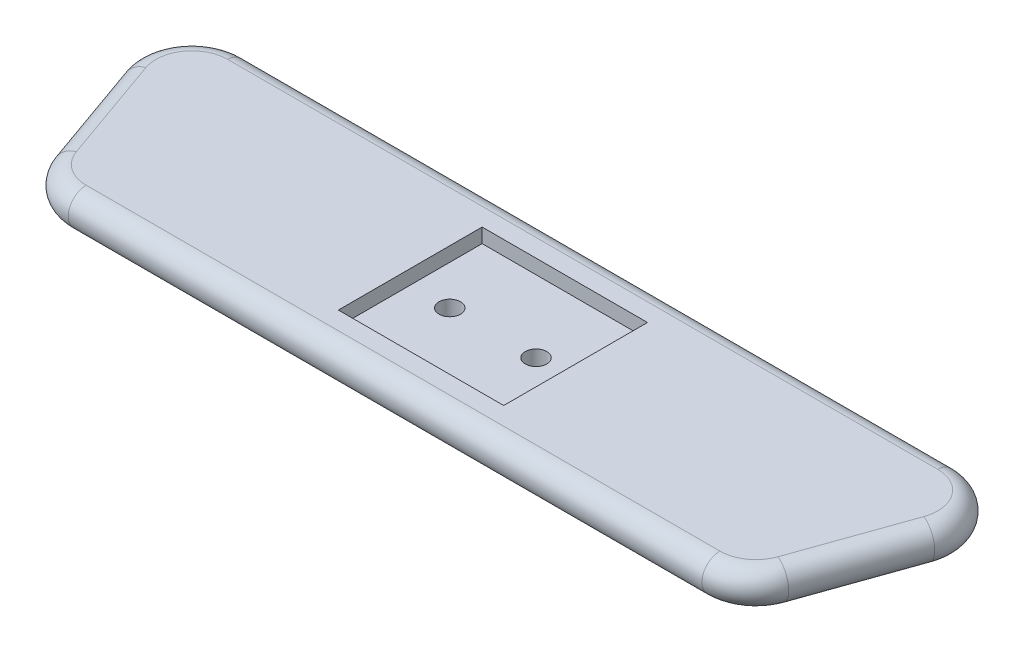
ISO-10303-21;
HEADER;
FILE_DESCRIPTION(('STEP AP214'),'2;1');
FILE_NAME('part.step','',(''),(''),'','','');
FILE_SCHEMA(('AUTOMOTIVE_DESIGN { 1 0 10303 214 1 1 1 1 }'));
ENDSEC;
DATA;
#1=APPLICATION_CONTEXT('core data for automotive mechanical design processes');
#2=APPLICATION_PROTOCOL_DEFINITION('international standard','automotive_design',2000,#1);
#3=PRODUCT_CONTEXT('',#1,'mechanical');
#4=PRODUCT('Part','Part','',(#3));
#5=PRODUCT_RELATED_PRODUCT_CATEGORY('part','',(#4));
#6=PRODUCT_DEFINITION_FORMATION('','',#4);
#7=PRODUCT_DEFINITION_CONTEXT('part definition',#1,'design');
#8=PRODUCT_DEFINITION('design','',#6,#7);
#9=PRODUCT_DEFINITION_SHAPE('','',#8);
#10=(LENGTH_UNIT() NAMED_UNIT(*) SI_UNIT(.MILLI.,.METRE.));
#11=(NAMED_UNIT(*) PLANE_ANGLE_UNIT() SI_UNIT($,.RADIAN.));
#12=(NAMED_UNIT(*) SI_UNIT($,.STERADIAN.) SOLID_ANGLE_UNIT());
#13=UNCERTAINTY_MEASURE_WITH_UNIT(LENGTH_MEASURE(1.E-05),#10,'distance_accuracy_value','');
#14=(GEOMETRIC_REPRESENTATION_CONTEXT(3) GLOBAL_UNCERTAINTY_ASSIGNED_CONTEXT((#13)) GLOBAL_UNIT_ASSIGNED_CONTEXT((#10,
#11,#12)) REPRESENTATION_CONTEXT('',''));
#15=CARTESIAN_POINT('',(0.,0.,0.));
#16=DIRECTION('',(0.,0.,1.));
#17=DIRECTION('',(1.,0.,0.));
#18=AXIS2_PLACEMENT_3D('',#15,#16,#17);
#19=CARTESIAN_POINT('',(-88.1519337423437,5.,19.9928971114934));
#20=DIRECTION('',(1.,0.,0.));
#21=DIRECTION('',(0.,0.,-1.));
#22=AXIS2_PLACEMENT_3D('',#19,#20,#21);
#23=CYLINDRICAL_SURFACE('',#22,5.);
#24=CARTESIAN_POINT('',(88.1519337423434,5.,19.9928971114934));
#25=DIRECTION('',(1.,0.,0.));
#26=DIRECTION('',(0.,0.,-1.));
#27=AXIS2_PLACEMENT_3D('',#24,#25,#26);
#28=CIRCLE('',#27,5.);
#29=CARTESIAN_POINT('',(88.1519337423434,10.,19.9928971114934));
#30=VERTEX_POINT('',#29);
#31=CARTESIAN_POINT('',(88.1519337423434,0.,19.9928971114934));
#32=VERTEX_POINT('',#31);
#33=EDGE_CURVE('E11',#30,#32,#28,.T.);
#34=ORIENTED_EDGE('',*,*,#33,.F.);
#35=DIRECTION('',(1.,0.,0.));
#36=VECTOR('',#35,1.);
#37=CARTESIAN_POINT('',(88.1519337423434,10.,19.9928971114934));
#38=LINE('',#37,#36);
#39=CARTESIAN_POINT('',(-88.1519337423437,10.,19.9928971114934));
#40=VERTEX_POINT('',#39);
#41=EDGE_CURVE('E186',#40,#30,#38,.T.);
#42=ORIENTED_EDGE('',*,*,#41,.F.);
#43=CARTESIAN_POINT('',(-88.1519337423437,5.,19.9928971114934));
#44=DIRECTION('',(1.,0.,0.));
#45=DIRECTION('',(0.,0.,-1.));
#46=AXIS2_PLACEMENT_3D('',#43,#44,#45);
#47=CIRCLE('',#46,5.);
#48=CARTESIAN_POINT('',(-88.1519337423437,0.,19.9928971114934));
#49=VERTEX_POINT('',#48);
#50=EDGE_CURVE('E56',#40,#49,#47,.T.);
#51=ORIENTED_EDGE('',*,*,#50,.T.);
#52=DIRECTION('',(-1.,0.,0.));
#53=VECTOR('',#52,1.);
#54=CARTESIAN_POINT('',(-88.1519337423437,0.,19.9928971114934));
#55=LINE('',#54,#53);
#56=EDGE_CURVE('E223',#32,#49,#55,.T.);
#57=ORIENTED_EDGE('',*,*,#56,.F.);
#58=EDGE_LOOP('',(#34,#42,#51,#57));
#59=FACE_BOUND('',#58,.T.);
#60=ADVANCED_FACE('F47',(#59),#23,.T.);
#61=CARTESIAN_POINT('',(-88.1519337423437,5.,9.99289711149338));
#62=DIRECTION('',(0.,1.,0.));
#63=DIRECTION('',(0.,0.,1.));
#64=AXIS2_PLACEMENT_3D('',#61,#62,#63);
#65=TOROIDAL_SURFACE('',#64,10.,5.);
#66=ORIENTED_EDGE('',*,*,#50,.F.);
#67=CARTESIAN_POINT('',(-88.1519337423437,10.,9.99289711149338));
#68=DIRECTION('',(0.,-1.,0.));
#69=DIRECTION('',(0.,0.,-1.));
#70=AXIS2_PLACEMENT_3D('',#67,#68,#69);
#71=CIRCLE('',#70,10.);
#72=CARTESIAN_POINT('',(-97.5783486532655,10.,13.3309657038311));
#73=VERTEX_POINT('',#72);
#74=EDGE_CURVE('E195',#73,#40,#71,.F.);
#75=ORIENTED_EDGE('',*,*,#74,.F.);
#76=CARTESIAN_POINT('',(-97.5783486532655,5.,13.3309657038311));
#77=DIRECTION('',(0.333806859233767,0.,0.94264149109218));
#78=DIRECTION('',(0.94264149109218,0.,-0.333806859233767));
#79=AXIS2_PLACEMENT_3D('',#76,#77,#78);
#80=CIRCLE('',#79,5.);
#81=CARTESIAN_POINT('',(-97.5783486532655,0.,13.3309657038311));
#82=VERTEX_POINT('',#81);
#83=EDGE_CURVE('E269',#73,#82,#80,.T.);
#84=ORIENTED_EDGE('',*,*,#83,.T.);
#85=CARTESIAN_POINT('',(-88.1519337423437,0.,9.99289711149338));
#86=DIRECTION('',(0.,-1.,0.));
#87=DIRECTION('',(0.,0.,-1.));
#88=AXIS2_PLACEMENT_3D('',#85,#86,#87);
#89=CIRCLE('',#88,10.);
#90=EDGE_CURVE('E227',#49,#82,#89,.T.);
#91=ORIENTED_EDGE('',*,*,#90,.F.);
#92=EDGE_LOOP('',(#66,#75,#84,#91));
#93=FACE_BOUND('',#92,.T.);
#94=ADVANCED_FACE('F278',(#93),#65,.T.);
#95=CARTESIAN_POINT('',(-108.201905829186,5.,-16.6690342961689));
#96=DIRECTION('',(0.333806859233768,0.,0.94264149109218));
#97=DIRECTION('',(0.94264149109218,0.,-0.333806859233768));
#98=AXIS2_PLACEMENT_3D('',#95,#96,#97);
#99=CYLINDRICAL_SURFACE('',#98,5.);
#100=ORIENTED_EDGE('',*,*,#83,.F.);
#101=DIRECTION('',(0.333806859233768,0.,0.94264149109218));
#102=VECTOR('',#101,1.);
#103=CARTESIAN_POINT('',(-77.9333342134071,10.,68.8067751183617));
#104=LINE('',#103,#102);
#105=CARTESIAN_POINT('',(-108.201905829186,10.,-16.6690342961689));
#106=VERTEX_POINT('',#105);
#107=EDGE_CURVE('E199',#106,#73,#104,.T.);
#108=ORIENTED_EDGE('',*,*,#107,.F.);
#109=CARTESIAN_POINT('',(-108.201905829186,5.,-16.6690342961689));
#110=DIRECTION('',(0.333806859233768,0.,0.942641491092179));
#111=DIRECTION('',(0.942641491092179,0.,-0.333806859233768));
#112=AXIS2_PLACEMENT_3D('',#109,#110,#111);
#113=CIRCLE('',#112,5.);
#114=CARTESIAN_POINT('',(-108.201905829186,0.,-16.6690342961689));
#115=VERTEX_POINT('',#114);
#116=EDGE_CURVE('E266',#106,#115,#113,.T.);
#117=ORIENTED_EDGE('',*,*,#116,.T.);
#118=DIRECTION('',(-0.333806859233768,0.,-0.94264149109218));
#119=VECTOR('',#118,1.);
#120=CARTESIAN_POINT('',(-108.201905829186,0.,-16.6690342961689));
#121=LINE('',#120,#119);
#122=EDGE_CURVE('E231',#82,#115,#121,.T.);
#123=ORIENTED_EDGE('',*,*,#122,.F.);
#124=EDGE_LOOP('',(#100,#108,#117,#123));
#125=FACE_BOUND('',#124,.T.);
#126=ADVANCED_FACE('F290',(#125),#99,.T.);
#127=CARTESIAN_POINT('',(-98.7754909182645,5.,-20.0071028885066));
#128=DIRECTION('',(0.,1.,0.));
#129=DIRECTION('',(0.,0.,1.));
#130=AXIS2_PLACEMENT_3D('',#127,#128,#129);
#131=TOROIDAL_SURFACE('',#130,10.,5.);
#132=ORIENTED_EDGE('',*,*,#116,.F.);
#133=CARTESIAN_POINT('',(-98.7754909182645,10.,-20.0071028885066));
#134=DIRECTION('',(0.,-1.,0.));
#135=DIRECTION('',(0.,0.,-1.));
#136=AXIS2_PLACEMENT_3D('',#133,#134,#135);
#137=CIRCLE('',#136,10.);
#138=CARTESIAN_POINT('',(-98.7754909182645,10.,-30.0071028885066));
#139=VERTEX_POINT('',#138);
#140=EDGE_CURVE('E203',#139,#106,#137,.F.);
#141=ORIENTED_EDGE('',*,*,#140,.F.);
#142=CARTESIAN_POINT('',(-98.7754909182645,5.,-30.0071028885066));
#143=DIRECTION('',(-1.,0.,0.));
#144=DIRECTION('',(0.,-1.,0.));
#145=AXIS2_PLACEMENT_3D('',#142,#143,#144);
#146=CIRCLE('',#145,5.);
#147=CARTESIAN_POINT('',(-98.7754909182645,0.,-30.0071028885066));
#148=VERTEX_POINT('',#147);
#149=EDGE_CURVE('E263',#139,#148,#146,.T.);
#150=ORIENTED_EDGE('',*,*,#149,.T.);
#151=CARTESIAN_POINT('',(-98.7754909182645,0.,-20.0071028885066));
#152=DIRECTION('',(0.,-1.,0.));
#153=DIRECTION('',(0.,0.,-1.));
#154=AXIS2_PLACEMENT_3D('',#151,#152,#153);
#155=CIRCLE('',#154,10.);
#156=EDGE_CURVE('E235',#115,#148,#155,.T.);
#157=ORIENTED_EDGE('',*,*,#156,.F.);
#158=EDGE_LOOP('',(#132,#141,#150,#157));
#159=FACE_BOUND('',#158,.T.);
#160=ADVANCED_FACE('F294',(#159),#131,.T.);
#161=CARTESIAN_POINT('',(98.7754909182645,5.,-30.0071028885066));
#162=DIRECTION('',(-1.,0.,0.));
#163=DIRECTION('',(0.,0.,1.));
#164=AXIS2_PLACEMENT_3D('',#161,#162,#163);
#165=CYLINDRICAL_SURFACE('',#164,5.);
#166=ORIENTED_EDGE('',*,*,#149,.F.);
#167=DIRECTION('',(-1.,0.,0.));
#168=VECTOR('',#167,1.);
#169=CARTESIAN_POINT('',(88.1519337423434,10.,-30.0071028885067));
#170=LINE('',#169,#168);
#171=CARTESIAN_POINT('',(98.7754909182645,10.,-30.0071028885067));
#172=VERTEX_POINT('',#171);
#173=EDGE_CURVE('E207',#172,#139,#170,.T.);
#174=ORIENTED_EDGE('',*,*,#173,.F.);
#175=CARTESIAN_POINT('',(98.7754909182645,5.,-30.0071028885066));
#176=DIRECTION('',(-1.,0.,0.));
#177=DIRECTION('',(0.,0.,1.));
#178=AXIS2_PLACEMENT_3D('',#175,#176,#177);
#179=CIRCLE('',#178,5.);
#180=CARTESIAN_POINT('',(98.7754909182645,0.,-30.0071028885067));
#181=VERTEX_POINT('',#180);
#182=EDGE_CURVE('E260',#172,#181,#179,.T.);
#183=ORIENTED_EDGE('',*,*,#182,.T.);
#184=DIRECTION('',(1.,0.,0.));
#185=VECTOR('',#184,1.);
#186=CARTESIAN_POINT('',(98.7754909182645,0.,-30.0071028885066));
#187=LINE('',#186,#185);
#188=EDGE_CURVE('E239',#148,#181,#187,.T.);
#189=ORIENTED_EDGE('',*,*,#188,.F.);
#190=EDGE_LOOP('',(#166,#174,#183,#189));
#191=FACE_BOUND('',#190,.T.);
#192=ADVANCED_FACE('F297',(#191),#165,.T.);
#193=CARTESIAN_POINT('',(98.7754909182645,5.,-20.0071028885066));
#194=DIRECTION('',(0.,1.,0.));
#195=DIRECTION('',(0.,0.,1.));
#196=AXIS2_PLACEMENT_3D('',#193,#194,#195);
#197=TOROIDAL_SURFACE('',#196,10.,5.);
#198=ORIENTED_EDGE('',*,*,#182,.F.);
#199=CARTESIAN_POINT('',(98.7754909182645,10.,-20.0071028885066));
#200=DIRECTION('',(0.,-1.,0.));
#201=DIRECTION('',(0.,0.,-1.));
#202=AXIS2_PLACEMENT_3D('',#199,#200,#201);
#203=CIRCLE('',#202,10.);
#204=CARTESIAN_POINT('',(108.201905829186,10.,-16.6690342961689));
#205=VERTEX_POINT('',#204);
#206=EDGE_CURVE('E211',#205,#172,#203,.F.);
#207=ORIENTED_EDGE('',*,*,#206,.F.);
#208=CARTESIAN_POINT('',(108.201905829186,5.,-16.6690342961689));
#209=DIRECTION('',(0.333806859233774,0.,-0.942641491092177));
#210=DIRECTION('',(-0.942641491092177,0.,-0.333806859233774));
#211=AXIS2_PLACEMENT_3D('',#208,#209,#210);
#212=CIRCLE('',#211,5.);
#213=CARTESIAN_POINT('',(108.201905829186,0.,-16.6690342961689));
#214=VERTEX_POINT('',#213);
#215=EDGE_CURVE('E257',#205,#214,#212,.T.);
#216=ORIENTED_EDGE('',*,*,#215,.T.);
#217=CARTESIAN_POINT('',(98.7754909182645,0.,-20.0071028885066));
#218=DIRECTION('',(0.,-1.,0.));
#219=DIRECTION('',(0.,0.,-1.));
#220=AXIS2_PLACEMENT_3D('',#217,#218,#219);
#221=CIRCLE('',#220,10.);
#222=EDGE_CURVE('E243',#181,#214,#221,.T.);
#223=ORIENTED_EDGE('',*,*,#222,.F.);
#224=EDGE_LOOP('',(#198,#207,#216,#223));
#225=FACE_BOUND('',#224,.T.);
#226=ADVANCED_FACE('F301',(#225),#197,.T.);
#227=CARTESIAN_POINT('',(97.5783486532652,5.,13.3309657038312));
#228=DIRECTION('',(0.333806859233775,0.,-0.942641491092177));
#229=DIRECTION('',(-0.942641491092177,0.,-0.333806859233775));
#230=AXIS2_PLACEMENT_3D('',#227,#228,#229);
#231=CYLINDRICAL_SURFACE('',#230,5.);
#232=ORIENTED_EDGE('',*,*,#215,.F.);
#233=DIRECTION('',(0.333806859233775,0.,-0.942641491092177));
#234=VECTOR('',#233,1.);
#235=CARTESIAN_POINT('',(97.5783486532652,10.,13.3309657038312));
#236=LINE('',#235,#234);
#237=CARTESIAN_POINT('',(97.5783486532652,10.,13.3309657038312));
#238=VERTEX_POINT('',#237);
#239=EDGE_CURVE('E215',#238,#205,#236,.T.);
#240=ORIENTED_EDGE('',*,*,#239,.F.);
#241=CARTESIAN_POINT('',(97.5783486532652,5.,13.3309657038312));
#242=DIRECTION('',(0.333806859233775,0.,-0.942641491092177));
#243=DIRECTION('',(-0.942641491092177,0.,-0.333806859233775));
#244=AXIS2_PLACEMENT_3D('',#241,#242,#243);
#245=CIRCLE('',#244,5.);
#246=CARTESIAN_POINT('',(97.5783486532652,0.,13.3309657038312));
#247=VERTEX_POINT('',#246);
#248=EDGE_CURVE('E71',#238,#247,#245,.T.);
#249=ORIENTED_EDGE('',*,*,#248,.T.);
#250=DIRECTION('',(-0.333806859233775,0.,0.942641491092177));
#251=VECTOR('',#250,1.);
#252=CARTESIAN_POINT('',(97.5783486532652,0.,13.3309657038312));
#253=LINE('',#252,#251);
#254=EDGE_CURVE('E247',#214,#247,#253,.T.);
#255=ORIENTED_EDGE('',*,*,#254,.F.);
#256=EDGE_LOOP('',(#232,#240,#249,#255));
#257=FACE_BOUND('',#256,.T.);
#258=ADVANCED_FACE('F302',(#257),#231,.T.);
#259=CARTESIAN_POINT('',(88.1519337423434,5.,9.99289711149341));
#260=DIRECTION('',(0.,1.,0.));
#261=DIRECTION('',(0.,0.,1.));
#262=AXIS2_PLACEMENT_3D('',#259,#260,#261);
#263=TOROIDAL_SURFACE('',#262,10.,5.);
#264=CARTESIAN_POINT('',(88.1519337423434,10.,9.99289711149341));
#265=DIRECTION('',(0.,-1.,0.));
#266=DIRECTION('',(0.,0.,-1.));
#267=AXIS2_PLACEMENT_3D('',#264,#265,#266);
#268=CIRCLE('',#267,10.);
#269=EDGE_CURVE('E219',#30,#238,#268,.F.);
#270=ORIENTED_EDGE('',*,*,#269,.F.);
#271=ORIENTED_EDGE('',*,*,#33,.T.);
#272=CARTESIAN_POINT('',(88.1519337423434,0.,9.99289711149341));
#273=DIRECTION('',(0.,-1.,0.));
#274=DIRECTION('',(0.,0.,-1.));
#275=AXIS2_PLACEMENT_3D('',#272,#273,#274);
#276=CIRCLE('',#275,10.);
#277=EDGE_CURVE('E251',#247,#32,#276,.T.);
#278=ORIENTED_EDGE('',*,*,#277,.F.);
#279=ORIENTED_EDGE('',*,*,#248,.F.);
#280=EDGE_LOOP('',(#270,#271,#278,#279));
#281=FACE_BOUND('',#280,.T.);
#282=ADVANCED_FACE('F284',(#281),#263,.T.);
#283=CARTESIAN_POINT('',(88.1519337423434,10.,9.99289711149341));
#284=DIRECTION('',(0.,-1.,0.));
#285=DIRECTION('',(0.,0.,-1.));
#286=AXIS2_PLACEMENT_3D('',#283,#284,#285);
#287=PLANE('',#286);
#288=DIRECTION('',(-1.,0.,0.));
#289=VECTOR('',#288,1.);
#290=CARTESIAN_POINT('',(-23.,10.,-25.0071028885066));
#291=LINE('',#290,#289);
#292=CARTESIAN_POINT('',(23.,10.,-25.0071028885066));
#293=VERTEX_POINT('',#292);
#294=CARTESIAN_POINT('',(-23.,10.,-25.0071028885066));
#295=VERTEX_POINT('',#294);
#296=EDGE_CURVE('E176',#293,#295,#291,.T.);
#297=ORIENTED_EDGE('',*,*,#296,.F.);
#298=DIRECTION('',(0.,0.,-1.));
#299=VECTOR('',#298,1.);
#300=CARTESIAN_POINT('',(23.,10.,-25.0071028885066));
#301=LINE('',#300,#299);
#302=CARTESIAN_POINT('',(23.,10.,14.9928971114934));
#303=VERTEX_POINT('',#302);
#304=EDGE_CURVE('E63',#303,#293,#301,.T.);
#305=ORIENTED_EDGE('',*,*,#304,.F.);
#306=DIRECTION('',(1.,0.,0.));
#307=VECTOR('',#306,1.);
#308=CARTESIAN_POINT('',(-23.,10.,14.9928971114934));
#309=LINE('',#308,#307);
#310=CARTESIAN_POINT('',(-23.,10.,14.9928971114934));
#311=VERTEX_POINT('',#310);
#312=EDGE_CURVE('E160',#311,#303,#309,.T.);
#313=ORIENTED_EDGE('',*,*,#312,.F.);
#314=DIRECTION('',(0.,0.,1.));
#315=VECTOR('',#314,1.);
#316=CARTESIAN_POINT('',(-23.,10.,-25.0071028885066));
#317=LINE('',#316,#315);
#318=EDGE_CURVE('E164',#295,#311,#317,.T.);
#319=ORIENTED_EDGE('',*,*,#318,.F.);
#320=EDGE_LOOP('',(#297,#305,#313,#319));
#321=FACE_BOUND('',#320,.T.);
#322=ORIENTED_EDGE('',*,*,#41,.T.);
#323=ORIENTED_EDGE('',*,*,#269,.T.);
#324=ORIENTED_EDGE('',*,*,#239,.T.);
#325=ORIENTED_EDGE('',*,*,#206,.T.);
#326=ORIENTED_EDGE('',*,*,#173,.T.);
#327=ORIENTED_EDGE('',*,*,#140,.T.);
#328=ORIENTED_EDGE('',*,*,#107,.T.);
#329=ORIENTED_EDGE('',*,*,#74,.T.);
#330=EDGE_LOOP('',(#322,#323,#324,#325,#326,#327,#328,#329));
#331=FACE_BOUND('',#330,.T.);
#332=ADVANCED_FACE('F286',(#321,#331),#287,.F.);
#333=CARTESIAN_POINT('',(88.1519337423434,0.,9.99289711149341));
#334=DIRECTION('',(0.,-1.,0.));
#335=DIRECTION('',(0.,0.,-1.));
#336=AXIS2_PLACEMENT_3D('',#333,#334,#335);
#337=PLANE('',#336);
#338=CARTESIAN_POINT('',(69.9999999999999,0.,2.99289711149415));
#339=DIRECTION('',(0.,-1.,0.));
#340=DIRECTION('',(0.,0.,1.));
#341=AXIS2_PLACEMENT_3D('',#338,#339,#340);
#342=CIRCLE('',#341,1.99999999999999);
#343=CARTESIAN_POINT('',(69.9999999999999,0.,4.99289711149414));
#344=VERTEX_POINT('',#343);
#345=EDGE_CURVE('E433',#344,#344,#342,.T.);
#346=ORIENTED_EDGE('',*,*,#345,.F.);
#347=EDGE_LOOP('',(#346));
#348=FACE_BOUND('',#347,.T.);
#349=CARTESIAN_POINT('',(70.,0.,-13.0071028885059));
#350=DIRECTION('',(0.,-1.,0.));
#351=DIRECTION('',(0.,0.,-1.));
#352=AXIS2_PLACEMENT_3D('',#349,#350,#351);
#353=CIRCLE('',#352,2.);
#354=CARTESIAN_POINT('',(70.,0.,-15.0071028885059));
#355=VERTEX_POINT('',#354);
#356=EDGE_CURVE('E423',#355,#355,#353,.T.);
#357=ORIENTED_EDGE('',*,*,#356,.F.);
#358=EDGE_LOOP('',(#357));
#359=FACE_BOUND('',#358,.T.);
#360=CARTESIAN_POINT('',(-70.,0.,-13.0071028885066));
#361=DIRECTION('',(0.,-1.,0.));
#362=DIRECTION('',(0.,0.,1.));
#363=AXIS2_PLACEMENT_3D('',#360,#361,#362);
#364=CIRCLE('',#363,2.);
#365=CARTESIAN_POINT('',(-70.,0.,-11.0071028885066));
#366=VERTEX_POINT('',#365);
#367=EDGE_CURVE('E413',#366,#366,#364,.T.);
#368=ORIENTED_EDGE('',*,*,#367,.F.);
#369=EDGE_LOOP('',(#368));
#370=FACE_BOUND('',#369,.T.);
#371=CARTESIAN_POINT('',(-70.,0.,2.99289711149337));
#372=DIRECTION('',(0.,-1.,0.));
#373=DIRECTION('',(0.,0.,-1.));
#374=AXIS2_PLACEMENT_3D('',#371,#372,#373);
#375=CIRCLE('',#374,2.);
#376=CARTESIAN_POINT('',(-70.,0.,0.992897111493374));
#377=VERTEX_POINT('',#376);
#378=EDGE_CURVE('E416',#377,#377,#375,.T.);
#379=ORIENTED_EDGE('',*,*,#378,.F.);
#380=EDGE_LOOP('',(#379));
#381=FACE_BOUND('',#380,.T.);
#382=CARTESIAN_POINT('',(-12.,0.,-5.00710288850664));
#383=DIRECTION('',(0.,-1.,0.));
#384=DIRECTION('',(0.,0.,-1.));
#385=AXIS2_PLACEMENT_3D('',#382,#383,#384);
#386=CIRCLE('',#385,3.);
#387=CARTESIAN_POINT('',(-12.,0.,-8.00710288850664));
#388=VERTEX_POINT('',#387);
#389=EDGE_CURVE('E447',#388,#388,#386,.F.);
#390=ORIENTED_EDGE('',*,*,#389,.T.);
#391=EDGE_LOOP('',(#390));
#392=FACE_BOUND('',#391,.T.);
#393=CARTESIAN_POINT('',(12.,0.,-5.00710288850663));
#394=DIRECTION('',(0.,-1.,0.));
#395=DIRECTION('',(0.,0.,-1.));
#396=AXIS2_PLACEMENT_3D('',#393,#394,#395);
#397=CIRCLE('',#396,3.);
#398=CARTESIAN_POINT('',(12.,0.,-8.00710288850663));
#399=VERTEX_POINT('',#398);
#400=EDGE_CURVE('E167',#399,#399,#397,.F.);
#401=ORIENTED_EDGE('',*,*,#400,.T.);
#402=EDGE_LOOP('',(#401));
#403=FACE_BOUND('',#402,.T.);
#404=ORIENTED_EDGE('',*,*,#254,.T.);
#405=ORIENTED_EDGE('',*,*,#277,.T.);
#406=ORIENTED_EDGE('',*,*,#56,.T.);
#407=ORIENTED_EDGE('',*,*,#90,.T.);
#408=ORIENTED_EDGE('',*,*,#122,.T.);
#409=ORIENTED_EDGE('',*,*,#156,.T.);
#410=ORIENTED_EDGE('',*,*,#188,.T.);
#411=ORIENTED_EDGE('',*,*,#222,.T.);
#412=EDGE_LOOP('',(#404,#405,#406,#407,#408,#409,#410,#411));
#413=FACE_BOUND('',#412,.T.);
#414=ADVANCED_FACE('F281',(#348,#359,#370,#381,#392,#403,#413),#337,.T.);
#415=CARTESIAN_POINT('',(23.,6.,-25.0071028885066));
#416=DIRECTION('',(1.,0.,0.));
#417=DIRECTION('',(0.,0.,-1.));
#418=AXIS2_PLACEMENT_3D('',#415,#416,#417);
#419=PLANE('',#418);
#420=ORIENTED_EDGE('',*,*,#304,.T.);
#421=DIRECTION('',(0.,1.,0.));
#422=VECTOR('',#421,1.);
#423=CARTESIAN_POINT('',(23.,6.,-25.0071028885066));
#424=LINE('',#423,#422);
#425=CARTESIAN_POINT('',(23.,6.,-25.0071028885066));
#426=VERTEX_POINT('',#425);
#427=EDGE_CURVE('E135',#426,#293,#424,.T.);
#428=ORIENTED_EDGE('',*,*,#427,.F.);
#429=DIRECTION('',(0.,0.,-1.));
#430=VECTOR('',#429,1.);
#431=CARTESIAN_POINT('',(23.,6.,-25.0071028885066));
#432=LINE('',#431,#430);
#433=CARTESIAN_POINT('',(23.,6.,14.9928971114934));
#434=VERTEX_POINT('',#433);
#435=EDGE_CURVE('E139',#434,#426,#432,.T.);
#436=ORIENTED_EDGE('',*,*,#435,.F.);
#437=DIRECTION('',(0.,1.,0.));
#438=VECTOR('',#437,1.);
#439=CARTESIAN_POINT('',(23.,6.,14.9928971114934));
#440=LINE('',#439,#438);
#441=EDGE_CURVE('E183',#434,#303,#440,.T.);
#442=ORIENTED_EDGE('',*,*,#441,.T.);
#443=EDGE_LOOP('',(#420,#428,#436,#442));
#444=FACE_BOUND('',#443,.T.);
#445=ADVANCED_FACE('F137',(#444),#419,.F.);
#446=CARTESIAN_POINT('',(-23.,6.,14.9928971114934));
#447=DIRECTION('',(0.,0.,1.));
#448=DIRECTION('',(1.,0.,0.));
#449=AXIS2_PLACEMENT_3D('',#446,#447,#448);
#450=PLANE('',#449);
#451=ORIENTED_EDGE('',*,*,#312,.T.);
#452=ORIENTED_EDGE('',*,*,#441,.F.);
#453=DIRECTION('',(1.,0.,0.));
#454=VECTOR('',#453,1.);
#455=CARTESIAN_POINT('',(-23.,6.,14.9928971114934));
#456=LINE('',#455,#454);
#457=CARTESIAN_POINT('',(-23.,6.,14.9928971114934));
#458=VERTEX_POINT('',#457);
#459=EDGE_CURVE('E146',#458,#434,#456,.T.);
#460=ORIENTED_EDGE('',*,*,#459,.F.);
#461=DIRECTION('',(0.,1.,0.));
#462=VECTOR('',#461,1.);
#463=CARTESIAN_POINT('',(-23.,6.,14.9928971114934));
#464=LINE('',#463,#462);
#465=EDGE_CURVE('E187',#458,#311,#464,.T.);
#466=ORIENTED_EDGE('',*,*,#465,.T.);
#467=EDGE_LOOP('',(#451,#452,#460,#466));
#468=FACE_BOUND('',#467,.T.);
#469=ADVANCED_FACE('F353',(#468),#450,.F.);
#470=CARTESIAN_POINT('',(-23.,6.,-25.0071028885066));
#471=DIRECTION('',(-1.,0.,0.));
#472=DIRECTION('',(0.,0.,1.));
#473=AXIS2_PLACEMENT_3D('',#470,#471,#472);
#474=PLANE('',#473);
#475=ORIENTED_EDGE('',*,*,#318,.T.);
#476=ORIENTED_EDGE('',*,*,#465,.F.);
#477=DIRECTION('',(0.,0.,1.));
#478=VECTOR('',#477,1.);
#479=CARTESIAN_POINT('',(-23.,6.,-25.0071028885066));
#480=LINE('',#479,#478);
#481=CARTESIAN_POINT('',(-23.,6.,-25.0071028885066));
#482=VERTEX_POINT('',#481);
#483=EDGE_CURVE('E155',#482,#458,#480,.T.);
#484=ORIENTED_EDGE('',*,*,#483,.F.);
#485=DIRECTION('',(0.,1.,0.));
#486=VECTOR('',#485,1.);
#487=CARTESIAN_POINT('',(-23.,6.,-25.0071028885066));
#488=LINE('',#487,#486);
#489=EDGE_CURVE('E145',#482,#295,#488,.T.);
#490=ORIENTED_EDGE('',*,*,#489,.T.);
#491=EDGE_LOOP('',(#475,#476,#484,#490));
#492=FACE_BOUND('',#491,.T.);
#493=ADVANCED_FACE('F356',(#492),#474,.F.);
#494=CARTESIAN_POINT('',(-23.,6.,-25.0071028885066));
#495=DIRECTION('',(0.,0.,-1.));
#496=DIRECTION('',(-1.,0.,0.));
#497=AXIS2_PLACEMENT_3D('',#494,#495,#496);
#498=PLANE('',#497);
#499=ORIENTED_EDGE('',*,*,#296,.T.);
#500=ORIENTED_EDGE('',*,*,#489,.F.);
#501=DIRECTION('',(-1.,0.,0.));
#502=VECTOR('',#501,1.);
#503=CARTESIAN_POINT('',(-23.,6.,-25.0071028885066));
#504=LINE('',#503,#502);
#505=EDGE_CURVE('E149',#426,#482,#504,.T.);
#506=ORIENTED_EDGE('',*,*,#505,.F.);
#507=ORIENTED_EDGE('',*,*,#427,.T.);
#508=EDGE_LOOP('',(#499,#500,#506,#507));
#509=FACE_BOUND('',#508,.T.);
#510=ADVANCED_FACE('F150',(#509),#498,.F.);
#511=CARTESIAN_POINT('',(0.,6.,0.));
#512=DIRECTION('',(0.,1.,0.));
#513=DIRECTION('',(0.,0.,1.));
#514=AXIS2_PLACEMENT_3D('',#511,#512,#513);
#515=PLANE('',#514);
#516=CARTESIAN_POINT('',(12.,6.,-5.00710288850663));
#517=DIRECTION('',(0.,1.,0.));
#518=DIRECTION('',(0.,0.,1.));
#519=AXIS2_PLACEMENT_3D('',#516,#517,#518);
#520=CIRCLE('',#519,3.);
#521=CARTESIAN_POINT('',(12.,6.,-2.00710288850663));
#522=VERTEX_POINT('',#521);
#523=EDGE_CURVE('E450',#522,#522,#520,.F.);
#524=ORIENTED_EDGE('',*,*,#523,.T.);
#525=EDGE_LOOP('',(#524));
#526=FACE_BOUND('',#525,.T.);
#527=CARTESIAN_POINT('',(-12.,6.,-5.00710288850664));
#528=DIRECTION('',(0.,1.,0.));
#529=DIRECTION('',(0.,0.,1.));
#530=AXIS2_PLACEMENT_3D('',#527,#528,#529);
#531=CIRCLE('',#530,3.);
#532=CARTESIAN_POINT('',(-12.,6.,-2.00710288850664));
#533=VERTEX_POINT('',#532);
#534=EDGE_CURVE('E177',#533,#533,#531,.F.);
#535=ORIENTED_EDGE('',*,*,#534,.T.);
#536=EDGE_LOOP('',(#535));
#537=FACE_BOUND('',#536,.T.);
#538=ORIENTED_EDGE('',*,*,#435,.T.);
#539=ORIENTED_EDGE('',*,*,#505,.T.);
#540=ORIENTED_EDGE('',*,*,#483,.T.);
#541=ORIENTED_EDGE('',*,*,#459,.T.);
#542=EDGE_LOOP('',(#538,#539,#540,#541));
#543=FACE_BOUND('',#542,.T.);
#544=ADVANCED_FACE('F157',(#526,#537,#543),#515,.T.);
#545=CARTESIAN_POINT('',(12.,-0.001000000000001,-5.00710288850663));
#546=DIRECTION('',(0.,1.,0.));
#547=DIRECTION('',(0.,0.,1.));
#548=AXIS2_PLACEMENT_3D('',#545,#546,#547);
#549=CYLINDRICAL_SURFACE('',#548,3.);
#550=ORIENTED_EDGE('',*,*,#400,.F.);
#551=EDGE_LOOP('',(#550));
#552=FACE_BOUND('',#551,.T.);
#553=ORIENTED_EDGE('',*,*,#523,.F.);
#554=EDGE_LOOP('',(#553));
#555=FACE_BOUND('',#554,.T.);
#556=ADVANCED_FACE('F365',(#552,#555),#549,.F.);
#557=CARTESIAN_POINT('',(-12.,-0.001000000000001,-5.00710288850664));
#558=DIRECTION('',(0.,1.,0.));
#559=DIRECTION('',(0.,0.,1.));
#560=AXIS2_PLACEMENT_3D('',#557,#558,#559);
#561=CYLINDRICAL_SURFACE('',#560,3.);
#562=ORIENTED_EDGE('',*,*,#389,.F.);
#563=EDGE_LOOP('',(#562));
#564=FACE_BOUND('',#563,.T.);
#565=ORIENTED_EDGE('',*,*,#534,.F.);
#566=EDGE_LOOP('',(#565));
#567=FACE_BOUND('',#566,.T.);
#568=ADVANCED_FACE('F369',(#564,#567),#561,.F.);
#569=CARTESIAN_POINT('',(-70.,8.,2.99289711149337));
#570=DIRECTION('',(0.,-1.,0.));
#571=DIRECTION('',(0.,0.,-1.));
#572=AXIS2_PLACEMENT_3D('',#569,#570,#571);
#573=CYLINDRICAL_SURFACE('',#572,2.);
#574=CARTESIAN_POINT('',(-70.,8.,2.99289711149337));
#575=DIRECTION('',(0.,-1.,0.));
#576=DIRECTION('',(0.,0.,-1.));
#577=AXIS2_PLACEMENT_3D('',#574,#575,#576);
#578=CIRCLE('',#577,2.);
#579=CARTESIAN_POINT('',(-70.,8.,0.992897111493374));
#580=VERTEX_POINT('',#579);
#581=EDGE_CURVE('E421',#580,#580,#578,.T.);
#582=ORIENTED_EDGE('',*,*,#581,.F.);
#583=EDGE_LOOP('',(#582));
#584=FACE_BOUND('',#583,.T.);
#585=ORIENTED_EDGE('',*,*,#378,.T.);
#586=EDGE_LOOP('',(#585));
#587=FACE_BOUND('',#586,.T.);
#588=ADVANCED_FACE('F373',(#584,#587),#573,.F.);
#589=CARTESIAN_POINT('',(-70.,8.,2.99289711149337));
#590=DIRECTION('',(0.,-1.,0.));
#591=DIRECTION('',(0.,0.,-1.));
#592=AXIS2_PLACEMENT_3D('',#589,#590,#591);
#593=PLANE('',#592);
#594=ORIENTED_EDGE('',*,*,#581,.T.);
#595=EDGE_LOOP('',(#594));
#596=FACE_BOUND('',#595,.T.);
#597=ADVANCED_FACE('F377',(#596),#593,.T.);
#598=CARTESIAN_POINT('',(-70.,8.,-13.0071028885066));
#599=DIRECTION('',(0.,-1.,0.));
#600=DIRECTION('',(0.,0.,-1.));
#601=AXIS2_PLACEMENT_3D('',#598,#599,#600);
#602=CYLINDRICAL_SURFACE('',#601,2.);
#603=CARTESIAN_POINT('',(-70.,8.,-13.0071028885066));
#604=DIRECTION('',(0.,-1.,0.));
#605=DIRECTION('',(0.,0.,1.));
#606=AXIS2_PLACEMENT_3D('',#603,#604,#605);
#607=CIRCLE('',#606,2.);
#608=CARTESIAN_POINT('',(-70.,8.,-11.0071028885066));
#609=VERTEX_POINT('',#608);
#610=EDGE_CURVE('E410',#609,#609,#607,.T.);
#611=ORIENTED_EDGE('',*,*,#610,.F.);
#612=EDGE_LOOP('',(#611));
#613=FACE_BOUND('',#612,.T.);
#614=ORIENTED_EDGE('',*,*,#367,.T.);
#615=EDGE_LOOP('',(#614));
#616=FACE_BOUND('',#615,.T.);
#617=ADVANCED_FACE('F381',(#613,#616),#602,.F.);
#618=CARTESIAN_POINT('',(-70.,8.,-13.0071028885066));
#619=DIRECTION('',(0.,1.,0.));
#620=DIRECTION('',(0.,0.,1.));
#621=AXIS2_PLACEMENT_3D('',#618,#619,#620);
#622=PLANE('',#621);
#623=ORIENTED_EDGE('',*,*,#610,.T.);
#624=EDGE_LOOP('',(#623));
#625=FACE_BOUND('',#624,.T.);
#626=ADVANCED_FACE('F398',(#625),#622,.F.);
#627=CARTESIAN_POINT('',(70.,8.,-13.0071028885059));
#628=DIRECTION('',(0.,-1.,0.));
#629=DIRECTION('',(0.,0.,-1.));
#630=AXIS2_PLACEMENT_3D('',#627,#628,#629);
#631=CYLINDRICAL_SURFACE('',#630,2.);
#632=CARTESIAN_POINT('',(70.,8.,-13.0071028885059));
#633=DIRECTION('',(0.,-1.,0.));
#634=DIRECTION('',(0.,0.,-1.));
#635=AXIS2_PLACEMENT_3D('',#632,#633,#634);
#636=CIRCLE('',#635,2.);
#637=CARTESIAN_POINT('',(70.,8.,-15.0071028885059));
#638=VERTEX_POINT('',#637);
#639=EDGE_CURVE('E429',#638,#638,#636,.T.);
#640=ORIENTED_EDGE('',*,*,#639,.F.);
#641=EDGE_LOOP('',(#640));
#642=FACE_BOUND('',#641,.T.);
#643=ORIENTED_EDGE('',*,*,#356,.T.);
#644=EDGE_LOOP('',(#643));
#645=FACE_BOUND('',#644,.T.);
#646=ADVANCED_FACE('F394',(#642,#645),#631,.F.);
#647=CARTESIAN_POINT('',(70.,8.,-13.0071028885059));
#648=DIRECTION('',(0.,-1.,0.));
#649=DIRECTION('',(0.,0.,-1.));
#650=AXIS2_PLACEMENT_3D('',#647,#648,#649);
#651=PLANE('',#650);
#652=ORIENTED_EDGE('',*,*,#639,.T.);
#653=EDGE_LOOP('',(#652));
#654=FACE_BOUND('',#653,.T.);
#655=ADVANCED_FACE('F390',(#654),#651,.T.);
#656=CARTESIAN_POINT('',(69.9999999999999,8.,2.99289711149415));
#657=DIRECTION('',(0.,-1.,0.));
#658=DIRECTION('',(0.,0.,-1.));
#659=AXIS2_PLACEMENT_3D('',#656,#657,#658);
#660=CYLINDRICAL_SURFACE('',#659,1.99999999999999);
#661=CARTESIAN_POINT('',(69.9999999999999,8.,2.99289711149415));
#662=DIRECTION('',(0.,-1.,0.));
#663=DIRECTION('',(0.,0.,1.));
#664=AXIS2_PLACEMENT_3D('',#661,#662,#663);
#665=CIRCLE('',#664,1.99999999999999);
#666=CARTESIAN_POINT('',(69.9999999999999,8.,4.99289711149414));
#667=VERTEX_POINT('',#666);
#668=EDGE_CURVE('E437',#667,#667,#665,.T.);
#669=ORIENTED_EDGE('',*,*,#668,.F.);
#670=EDGE_LOOP('',(#669));
#671=FACE_BOUND('',#670,.T.);
#672=ORIENTED_EDGE('',*,*,#345,.T.);
#673=EDGE_LOOP('',(#672));
#674=FACE_BOUND('',#673,.T.);
#675=ADVANCED_FACE('F386',(#671,#674),#660,.F.);
#676=CARTESIAN_POINT('',(69.9999999999999,8.,2.99289711149415));
#677=DIRECTION('',(0.,1.,0.));
#678=DIRECTION('',(0.,0.,1.));
#679=AXIS2_PLACEMENT_3D('',#676,#677,#678);
#680=PLANE('',#679);
#681=ORIENTED_EDGE('',*,*,#668,.T.);
#682=EDGE_LOOP('',(#681));
#683=FACE_BOUND('',#682,.T.);
#684=ADVANCED_FACE('F383',(#683),#680,.F.);
#685=CLOSED_SHELL('',(#60,#94,#126,#160,#192,#226,#258,#282,#332,#414,#445,#469,#493,#510,#544,
#556,#568,#588,#597,#617,#626,#646,#655,#675,#684));
#686=MANIFOLD_SOLID_BREP('B2',#685);
#687=ADVANCED_BREP_SHAPE_REPRESENTATION('',(#18,#686),#14);
#688=SHAPE_DEFINITION_REPRESENTATION(#9,#687);
ENDSEC;
END-ISO-10303-21;
